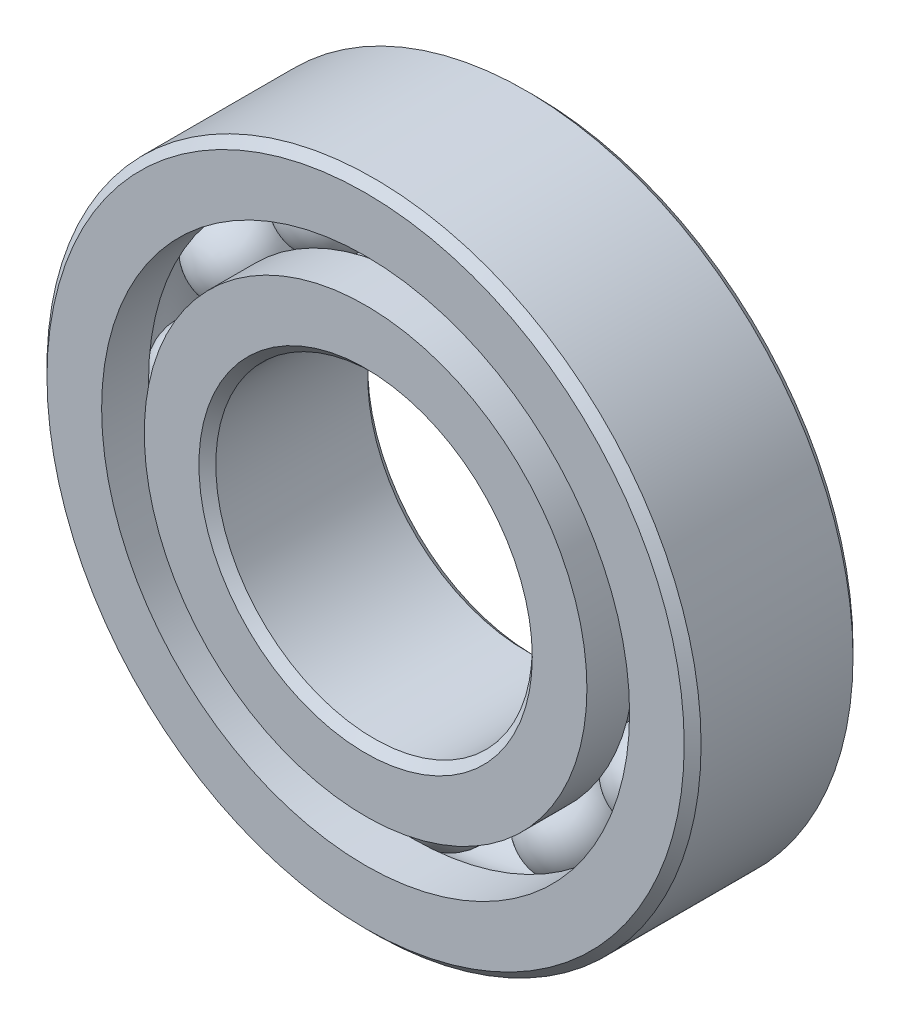
ISO-10303-21;
HEADER;
FILE_DESCRIPTION(('STEP AP214'),'2;1');
FILE_NAME('part.step','',(''),(''),'','','');
FILE_SCHEMA(('AUTOMOTIVE_DESIGN { 1 0 10303 214 1 1 1 1 }'));
ENDSEC;
DATA;
#1=APPLICATION_CONTEXT('core data for automotive mechanical design processes');
#2=APPLICATION_PROTOCOL_DEFINITION('international standard','automotive_design',2000,#1);
#3=PRODUCT_CONTEXT('',#1,'mechanical');
#4=PRODUCT('Part','Part','',(#3));
#5=PRODUCT_RELATED_PRODUCT_CATEGORY('part','',(#4));
#6=PRODUCT_DEFINITION_FORMATION('','',#4);
#7=PRODUCT_DEFINITION_CONTEXT('part definition',#1,'design');
#8=PRODUCT_DEFINITION('design','',#6,#7);
#9=PRODUCT_DEFINITION_SHAPE('','',#8);
#10=(LENGTH_UNIT() NAMED_UNIT(*) SI_UNIT(.MILLI.,.METRE.));
#11=(NAMED_UNIT(*) PLANE_ANGLE_UNIT() SI_UNIT($,.RADIAN.));
#12=(NAMED_UNIT(*) SI_UNIT($,.STERADIAN.) SOLID_ANGLE_UNIT());
#13=UNCERTAINTY_MEASURE_WITH_UNIT(LENGTH_MEASURE(1.E-05),#10,'distance_accuracy_value','');
#14=(GEOMETRIC_REPRESENTATION_CONTEXT(3) GLOBAL_UNCERTAINTY_ASSIGNED_CONTEXT((#13)) GLOBAL_UNIT_ASSIGNED_CONTEXT((#10,
#11,#12)) REPRESENTATION_CONTEXT('',''));
#15=CARTESIAN_POINT('',(0.,0.,0.));
#16=DIRECTION('',(0.,0.,1.));
#17=DIRECTION('',(1.,0.,0.));
#18=AXIS2_PLACEMENT_3D('',#15,#16,#17);
#19=CARTESIAN_POINT('',(-11.4999999999997,19.9185842870422,0.));
#20=DIRECTION('',(0.,0.,1.));
#21=DIRECTION('',(-0.499999999999989,0.866025403784445,0.));
#22=AXIS2_PLACEMENT_3D('',#19,#20,#21);
#23=SPHERICAL_SURFACE('',#22,4.0902775492629);
#24=CARTESIAN_POINT('',(-11.4999999999997,19.9185842870422,4.0902775492629));
#25=VERTEX_POINT('',#24);
#26=VERTEX_LOOP('',#25);
#27=FACE_BOUND('',#26,.T.);
#28=ADVANCED_FACE('F37',(#27),#23,.T.);
#29=CLOSED_SHELL('',(#28));
#30=MANIFOLD_SOLID_BREP('B2',#29);
#31=CARTESIAN_POINT('',(-19.918584287042,11.5000000000002,0.));
#32=DIRECTION('',(0.,0.,1.));
#33=DIRECTION('',(-0.866025403784433,0.50000000000001,0.));
#34=AXIS2_PLACEMENT_3D('',#31,#32,#33);
#35=SPHERICAL_SURFACE('',#34,4.0902775492629);
#36=CARTESIAN_POINT('',(-19.918584287042,11.5000000000002,4.0902775492629));
#37=VERTEX_POINT('',#36);
#38=VERTEX_LOOP('',#37);
#39=FACE_BOUND('',#38,.T.);
#40=ADVANCED_FACE('F57',(#39),#35,.T.);
#41=CLOSED_SHELL('',(#40));
#42=MANIFOLD_SOLID_BREP('B6',#41);
#43=CARTESIAN_POINT('',(-23.,2.40912212380176E-13,0.));
#44=DIRECTION('',(0.,0.,1.));
#45=DIRECTION('',(-1.,0.,0.));
#46=AXIS2_PLACEMENT_3D('',#43,#44,#45);
#47=SPHERICAL_SURFACE('',#46,4.0902775492629);
#48=CARTESIAN_POINT('',(-23.,2.40912212380176E-13,4.0902775492629));
#49=VERTEX_POINT('',#48);
#50=VERTEX_LOOP('',#49);
#51=FACE_BOUND('',#50,.T.);
#52=ADVANCED_FACE('F77',(#51),#47,.T.);
#53=CLOSED_SHELL('',(#52));
#54=MANIFOLD_SOLID_BREP('B33',#53);
#55=CARTESIAN_POINT('',(-19.9185842870422,-11.4999999999998,0.));
#56=DIRECTION('',(0.,0.,1.));
#57=DIRECTION('',(-0.866025403784443,-0.499999999999992,0.));
#58=AXIS2_PLACEMENT_3D('',#55,#56,#57);
#59=SPHERICAL_SURFACE('',#58,4.0902775492629);
#60=CARTESIAN_POINT('',(-19.9185842870422,-11.4999999999998,4.0902775492629));
#61=VERTEX_POINT('',#60);
#62=VERTEX_LOOP('',#61);
#63=FACE_BOUND('',#62,.T.);
#64=ADVANCED_FACE('F97',(#63),#59,.T.);
#65=CLOSED_SHELL('',(#64));
#66=MANIFOLD_SOLID_BREP('B53',#65);
#67=CARTESIAN_POINT('',(-11.5000000000002,-19.918584287042,0.));
#68=DIRECTION('',(0.,0.,1.));
#69=DIRECTION('',(-0.500000000000007,-0.866025403784435,0.));
#70=AXIS2_PLACEMENT_3D('',#67,#68,#69);
#71=SPHERICAL_SURFACE('',#70,4.0902775492629);
#72=CARTESIAN_POINT('',(-11.5000000000002,-19.918584287042,4.0902775492629));
#73=VERTEX_POINT('',#72);
#74=VERTEX_LOOP('',#73);
#75=FACE_BOUND('',#74,.T.);
#76=ADVANCED_FACE('F117',(#75),#71,.T.);
#77=CLOSED_SHELL('',(#76));
#78=MANIFOLD_SOLID_BREP('B73',#77);
#79=CARTESIAN_POINT('',(-1.60608141586784E-13,-23.,0.));
#80=DIRECTION('',(0.,0.,1.));
#81=DIRECTION('',(0.,-1.,0.));
#82=AXIS2_PLACEMENT_3D('',#79,#80,#81);
#83=SPHERICAL_SURFACE('',#82,4.0902775492629);
#84=CARTESIAN_POINT('',(-1.60608141586784E-13,-23.,4.0902775492629));
#85=VERTEX_POINT('',#84);
#86=VERTEX_LOOP('',#85);
#87=FACE_BOUND('',#86,.T.);
#88=ADVANCED_FACE('F137',(#87),#83,.T.);
#89=CLOSED_SHELL('',(#88));
#90=MANIFOLD_SOLID_BREP('B93',#89);
#91=CARTESIAN_POINT('',(11.4999999999999,-19.9185842870422,0.));
#92=DIRECTION('',(0.,0.,1.));
#93=DIRECTION('',(0.499999999999995,-0.866025403784442,0.));
#94=AXIS2_PLACEMENT_3D('',#91,#92,#93);
#95=SPHERICAL_SURFACE('',#94,4.0902775492629);
#96=CARTESIAN_POINT('',(11.4999999999999,-19.9185842870422,4.0902775492629));
#97=VERTEX_POINT('',#96);
#98=VERTEX_LOOP('',#97);
#99=FACE_BOUND('',#98,.T.);
#100=ADVANCED_FACE('F157',(#99),#95,.T.);
#101=CLOSED_SHELL('',(#100));
#102=MANIFOLD_SOLID_BREP('B113',#101);
#103=CARTESIAN_POINT('',(19.918584287042,-11.5000000000001,0.));
#104=DIRECTION('',(0.,0.,1.));
#105=DIRECTION('',(0.866025403784436,-0.500000000000004,0.));
#106=AXIS2_PLACEMENT_3D('',#103,#104,#105);
#107=SPHERICAL_SURFACE('',#106,4.0902775492629);
#108=CARTESIAN_POINT('',(19.918584287042,-11.5000000000001,4.0902775492629));
#109=VERTEX_POINT('',#108);
#110=VERTEX_LOOP('',#109);
#111=FACE_BOUND('',#110,.T.);
#112=ADVANCED_FACE('F177',(#111),#107,.T.);
#113=CLOSED_SHELL('',(#112));
#114=MANIFOLD_SOLID_BREP('B133',#113);
#115=CARTESIAN_POINT('',(23.,0.,0.));
#116=DIRECTION('',(0.,0.,1.));
#117=DIRECTION('',(1.,0.,0.));
#118=AXIS2_PLACEMENT_3D('',#115,#116,#117);
#119=SPHERICAL_SURFACE('',#118,4.0902775492629);
#120=CARTESIAN_POINT('',(23.,0.,4.0902775492629));
#121=VERTEX_POINT('',#120);
#122=VERTEX_LOOP('',#121);
#123=FACE_BOUND('',#122,.T.);
#124=ADVANCED_FACE('F197',(#123),#119,.T.);
#125=CLOSED_SHELL('',(#124));
#126=MANIFOLD_SOLID_BREP('B153',#125);
#127=CARTESIAN_POINT('',(19.9185842870421,11.5,0.));
#128=DIRECTION('',(0.,0.,1.));
#129=DIRECTION('',(0.86602540378444,0.499999999999998,0.));
#130=AXIS2_PLACEMENT_3D('',#127,#128,#129);
#131=SPHERICAL_SURFACE('',#130,4.0902775492629);
#132=CARTESIAN_POINT('',(19.9185842870421,11.5,4.0902775492629));
#133=VERTEX_POINT('',#132);
#134=VERTEX_LOOP('',#133);
#135=FACE_BOUND('',#134,.T.);
#136=ADVANCED_FACE('F217',(#135),#131,.T.);
#137=CLOSED_SHELL('',(#136));
#138=MANIFOLD_SOLID_BREP('B173',#137);
#139=CARTESIAN_POINT('',(11.5,19.9185842870421,0.));
#140=DIRECTION('',(0.,0.,1.));
#141=DIRECTION('',(0.500000000000001,0.866025403784438,0.));
#142=AXIS2_PLACEMENT_3D('',#139,#140,#141);
#143=SPHERICAL_SURFACE('',#142,4.0902775492629);
#144=CARTESIAN_POINT('',(11.5,19.9185842870421,4.0902775492629));
#145=VERTEX_POINT('',#144);
#146=VERTEX_LOOP('',#145);
#147=FACE_BOUND('',#146,.T.);
#148=ADVANCED_FACE('F237',(#147),#143,.T.);
#149=CLOSED_SHELL('',(#148));
#150=MANIFOLD_SOLID_BREP('B193',#149);
#151=CARTESIAN_POINT('',(0.,23.,0.));
#152=DIRECTION('',(0.,0.,1.));
#153=DIRECTION('',(0.,1.,0.));
#154=AXIS2_PLACEMENT_3D('',#151,#152,#153);
#155=SPHERICAL_SURFACE('',#154,4.0902775492629);
#156=CARTESIAN_POINT('',(0.,23.,4.0902775492629));
#157=VERTEX_POINT('',#156);
#158=VERTEX_LOOP('',#157);
#159=FACE_BOUND('',#158,.T.);
#160=ADVANCED_FACE('F259',(#159),#155,.T.);
#161=CLOSED_SHELL('',(#160));
#162=MANIFOLD_SOLID_BREP('B213',#161);
#163=CARTESIAN_POINT('',(0.,20.978021978022,8.));
#164=DIRECTION('',(0.,0.,-1.));
#165=DIRECTION('',(-1.,0.,0.));
#166=AXIS2_PLACEMENT_3D('',#163,#164,#165);
#167=PLANE('',#166);
#168=CARTESIAN_POINT('',(0.,0.,8.));
#169=DIRECTION('',(0.,0.,1.));
#170=DIRECTION('',(1.,0.,0.));
#171=AXIS2_PLACEMENT_3D('',#168,#169,#170);
#172=CIRCLE('',#171,15.8);
#173=CARTESIAN_POINT('',(15.8,0.,8.));
#174=VERTEX_POINT('',#173);
#175=EDGE_CURVE('E306',#174,#174,#172,.T.);
#176=ORIENTED_EDGE('',*,*,#175,.F.);
#177=EDGE_LOOP('',(#176));
#178=FACE_BOUND('',#177,.T.);
#179=CARTESIAN_POINT('',(0.,0.,8.));
#180=DIRECTION('',(0.,0.,1.));
#181=DIRECTION('',(1.,0.,0.));
#182=AXIS2_PLACEMENT_3D('',#179,#180,#181);
#183=CIRCLE('',#182,20.978021978022);
#184=CARTESIAN_POINT('',(20.978021978022,0.,8.));
#185=VERTEX_POINT('',#184);
#186=EDGE_CURVE('E258',#185,#185,#183,.T.);
#187=ORIENTED_EDGE('',*,*,#186,.T.);
#188=EDGE_LOOP('',(#187));
#189=FACE_BOUND('',#188,.T.);
#190=ADVANCED_FACE('F278',(#178,#189),#167,.F.);
#191=CARTESIAN_POINT('',(0.,0.,8.));
#192=DIRECTION('',(0.,0.,1.));
#193=DIRECTION('',(1.,0.,0.));
#194=AXIS2_PLACEMENT_3D('',#191,#192,#193);
#195=CYLINDRICAL_SURFACE('',#194,20.978021978022);
#196=ORIENTED_EDGE('',*,*,#186,.F.);
#197=EDGE_LOOP('',(#196));
#198=FACE_BOUND('',#197,.T.);
#199=CARTESIAN_POINT('',(0.,0.,3.55555555555555));
#200=DIRECTION('',(0.,0.,1.));
#201=DIRECTION('',(1.,0.,0.));
#202=AXIS2_PLACEMENT_3D('',#199,#200,#201);
#203=CIRCLE('',#202,20.978021978022);
#204=CARTESIAN_POINT('',(20.978021978022,0.,3.55555555555555));
#205=VERTEX_POINT('',#204);
#206=EDGE_CURVE('E284',#205,#205,#203,.T.);
#207=ORIENTED_EDGE('',*,*,#206,.T.);
#208=EDGE_LOOP('',(#207));
#209=FACE_BOUND('',#208,.T.);
#210=ADVANCED_FACE('F313',(#198,#209),#195,.T.);
#211=CARTESIAN_POINT('',(0.,0.,0.));
#212=DIRECTION('',(0.,0.,1.));
#213=DIRECTION('',(1.,0.,0.));
#214=AXIS2_PLACEMENT_3D('',#211,#212,#213);
#215=TOROIDAL_SURFACE('',#214,23.,4.09027754926289);
#216=ORIENTED_EDGE('',*,*,#206,.F.);
#217=EDGE_LOOP('',(#216));
#218=FACE_BOUND('',#217,.T.);
#219=CARTESIAN_POINT('',(0.,0.,-3.55555555555556));
#220=DIRECTION('',(0.,0.,1.));
#221=DIRECTION('',(1.,0.,0.));
#222=AXIS2_PLACEMENT_3D('',#219,#220,#221);
#223=CIRCLE('',#222,20.978021978022);
#224=CARTESIAN_POINT('',(20.978021978022,0.,-3.55555555555556));
#225=VERTEX_POINT('',#224);
#226=EDGE_CURVE('E288',#225,#225,#223,.T.);
#227=ORIENTED_EDGE('',*,*,#226,.T.);
#228=EDGE_LOOP('',(#227));
#229=FACE_BOUND('',#228,.T.);
#230=ADVANCED_FACE('F317',(#218,#229),#215,.F.);
#231=CARTESIAN_POINT('',(0.,0.,8.));
#232=DIRECTION('',(0.,0.,1.));
#233=DIRECTION('',(1.,0.,0.));
#234=AXIS2_PLACEMENT_3D('',#231,#232,#233);
#235=CYLINDRICAL_SURFACE('',#234,20.978021978022);
#236=ORIENTED_EDGE('',*,*,#226,.F.);
#237=EDGE_LOOP('',(#236));
#238=FACE_BOUND('',#237,.T.);
#239=CARTESIAN_POINT('',(0.,0.,-8.));
#240=DIRECTION('',(0.,0.,1.));
#241=DIRECTION('',(1.,0.,0.));
#242=AXIS2_PLACEMENT_3D('',#239,#240,#241);
#243=CIRCLE('',#242,20.978021978022);
#244=CARTESIAN_POINT('',(20.978021978022,0.,-8.));
#245=VERTEX_POINT('',#244);
#246=EDGE_CURVE('E292',#245,#245,#243,.T.);
#247=ORIENTED_EDGE('',*,*,#246,.T.);
#248=EDGE_LOOP('',(#247));
#249=FACE_BOUND('',#248,.T.);
#250=ADVANCED_FACE('F322',(#238,#249),#235,.T.);
#251=CARTESIAN_POINT('',(0.,15.8,-8.));
#252=DIRECTION('',(0.,0.,1.));
#253=DIRECTION('',(1.,0.,0.));
#254=AXIS2_PLACEMENT_3D('',#251,#252,#253);
#255=PLANE('',#254);
#256=ORIENTED_EDGE('',*,*,#246,.F.);
#257=EDGE_LOOP('',(#256));
#258=FACE_BOUND('',#257,.T.);
#259=CARTESIAN_POINT('',(0.,0.,-8.));
#260=DIRECTION('',(0.,0.,1.));
#261=DIRECTION('',(1.,0.,0.));
#262=AXIS2_PLACEMENT_3D('',#259,#260,#261);
#263=CIRCLE('',#262,15.8);
#264=CARTESIAN_POINT('',(15.8,0.,-8.));
#265=VERTEX_POINT('',#264);
#266=EDGE_CURVE('E297',#265,#265,#263,.T.);
#267=ORIENTED_EDGE('',*,*,#266,.T.);
#268=EDGE_LOOP('',(#267));
#269=FACE_BOUND('',#268,.T.);
#270=ADVANCED_FACE('F328',(#258,#269),#255,.F.);
#271=CARTESIAN_POINT('',(0.,0.,-7.2));
#272=DIRECTION('',(0.,0.,-1.));
#273=DIRECTION('',(-1.,0.,0.));
#274=AXIS2_PLACEMENT_3D('',#271,#272,#273);
#275=CONICAL_SURFACE('',#274,15.,0.785398163397452);
#276=ORIENTED_EDGE('',*,*,#266,.F.);
#277=EDGE_LOOP('',(#276));
#278=FACE_BOUND('',#277,.T.);
#279=CARTESIAN_POINT('',(0.,0.,-7.2));
#280=DIRECTION('',(0.,0.,1.));
#281=DIRECTION('',(1.,0.,0.));
#282=AXIS2_PLACEMENT_3D('',#279,#280,#281);
#283=CIRCLE('',#282,15.);
#284=CARTESIAN_POINT('',(15.,0.,-7.2));
#285=VERTEX_POINT('',#284);
#286=EDGE_CURVE('E300',#285,#285,#283,.T.);
#287=ORIENTED_EDGE('',*,*,#286,.T.);
#288=EDGE_LOOP('',(#287));
#289=FACE_BOUND('',#288,.T.);
#290=ADVANCED_FACE('F332',(#278,#289),#275,.F.);
#291=CARTESIAN_POINT('',(0.,0.,8.));
#292=DIRECTION('',(0.,0.,1.));
#293=DIRECTION('',(1.,0.,0.));
#294=AXIS2_PLACEMENT_3D('',#291,#292,#293);
#295=CYLINDRICAL_SURFACE('',#294,15.);
#296=ORIENTED_EDGE('',*,*,#286,.F.);
#297=EDGE_LOOP('',(#296));
#298=FACE_BOUND('',#297,.T.);
#299=CARTESIAN_POINT('',(0.,0.,7.2));
#300=DIRECTION('',(0.,0.,1.));
#301=DIRECTION('',(1.,0.,0.));
#302=AXIS2_PLACEMENT_3D('',#299,#300,#301);
#303=CIRCLE('',#302,15.);
#304=CARTESIAN_POINT('',(15.,0.,7.2));
#305=VERTEX_POINT('',#304);
#306=EDGE_CURVE('E303',#305,#305,#303,.T.);
#307=ORIENTED_EDGE('',*,*,#306,.T.);
#308=EDGE_LOOP('',(#307));
#309=FACE_BOUND('',#308,.T.);
#310=ADVANCED_FACE('F336',(#298,#309),#295,.F.);
#311=CARTESIAN_POINT('',(0.,0.,8.));
#312=DIRECTION('',(0.,0.,1.));
#313=DIRECTION('',(1.,0.,0.));
#314=AXIS2_PLACEMENT_3D('',#311,#312,#313);
#315=CONICAL_SURFACE('',#314,15.8,0.785398163397447);
#316=ORIENTED_EDGE('',*,*,#306,.F.);
#317=EDGE_LOOP('',(#316));
#318=FACE_BOUND('',#317,.T.);
#319=ORIENTED_EDGE('',*,*,#175,.T.);
#320=EDGE_LOOP('',(#319));
#321=FACE_BOUND('',#320,.T.);
#322=ADVANCED_FACE('F310',(#318,#321),#315,.F.);
#323=CLOSED_SHELL('',(#190,#210,#230,#250,#270,#290,#310,#322));
#324=MANIFOLD_SOLID_BREP('B233',#323);
#325=CARTESIAN_POINT('',(0.,0.,7.2));
#326=DIRECTION('',(0.,0.,-1.));
#327=DIRECTION('',(-1.,0.,0.));
#328=AXIS2_PLACEMENT_3D('',#325,#326,#327);
#329=CONICAL_SURFACE('',#328,31.,0.785398163397447);
#330=CARTESIAN_POINT('',(0.,0.,8.));
#331=DIRECTION('',(0.,0.,1.));
#332=DIRECTION('',(1.,0.,0.));
#333=AXIS2_PLACEMENT_3D('',#330,#331,#332);
#334=CIRCLE('',#333,30.2);
#335=CARTESIAN_POINT('',(30.2,0.,8.));
#336=VERTEX_POINT('',#335);
#337=EDGE_CURVE('E427',#336,#336,#334,.T.);
#338=ORIENTED_EDGE('',*,*,#337,.F.);
#339=EDGE_LOOP('',(#338));
#340=FACE_BOUND('',#339,.T.);
#341=CARTESIAN_POINT('',(0.,0.,7.2));
#342=DIRECTION('',(0.,0.,1.));
#343=DIRECTION('',(1.,0.,0.));
#344=AXIS2_PLACEMENT_3D('',#341,#342,#343);
#345=CIRCLE('',#344,31.);
#346=CARTESIAN_POINT('',(31.,0.,7.2));
#347=VERTEX_POINT('',#346);
#348=EDGE_CURVE('E277',#347,#347,#345,.T.);
#349=ORIENTED_EDGE('',*,*,#348,.T.);
#350=EDGE_LOOP('',(#349));
#351=FACE_BOUND('',#350,.T.);
#352=ADVANCED_FACE('F399',(#340,#351),#329,.T.);
#353=CARTESIAN_POINT('',(0.,0.,8.));
#354=DIRECTION('',(0.,0.,1.));
#355=DIRECTION('',(1.,0.,0.));
#356=AXIS2_PLACEMENT_3D('',#353,#354,#355);
#357=CYLINDRICAL_SURFACE('',#356,31.);
#358=ORIENTED_EDGE('',*,*,#348,.F.);
#359=EDGE_LOOP('',(#358));
#360=FACE_BOUND('',#359,.T.);
#361=CARTESIAN_POINT('',(0.,0.,-7.2));
#362=DIRECTION('',(0.,0.,1.));
#363=DIRECTION('',(1.,0.,0.));
#364=AXIS2_PLACEMENT_3D('',#361,#362,#363);
#365=CIRCLE('',#364,31.);
#366=CARTESIAN_POINT('',(31.,0.,-7.2));
#367=VERTEX_POINT('',#366);
#368=EDGE_CURVE('E405',#367,#367,#365,.T.);
#369=ORIENTED_EDGE('',*,*,#368,.T.);
#370=EDGE_LOOP('',(#369));
#371=FACE_BOUND('',#370,.T.);
#372=ADVANCED_FACE('F434',(#360,#371),#357,.T.);
#373=CARTESIAN_POINT('',(0.,0.,-8.));
#374=DIRECTION('',(0.,0.,1.));
#375=DIRECTION('',(1.,0.,0.));
#376=AXIS2_PLACEMENT_3D('',#373,#374,#375);
#377=CONICAL_SURFACE('',#376,30.2,0.785398163397448);
#378=ORIENTED_EDGE('',*,*,#368,.F.);
#379=EDGE_LOOP('',(#378));
#380=FACE_BOUND('',#379,.T.);
#381=CARTESIAN_POINT('',(0.,0.,-8.));
#382=DIRECTION('',(0.,0.,1.));
#383=DIRECTION('',(1.,0.,0.));
#384=AXIS2_PLACEMENT_3D('',#381,#382,#383);
#385=CIRCLE('',#384,30.2);
#386=CARTESIAN_POINT('',(30.2,0.,-8.));
#387=VERTEX_POINT('',#386);
#388=EDGE_CURVE('E409',#387,#387,#385,.T.);
#389=ORIENTED_EDGE('',*,*,#388,.T.);
#390=EDGE_LOOP('',(#389));
#391=FACE_BOUND('',#390,.T.);
#392=ADVANCED_FACE('F438',(#380,#391),#377,.T.);
#393=CARTESIAN_POINT('',(0.,30.2,-8.));
#394=DIRECTION('',(0.,0.,1.));
#395=DIRECTION('',(1.,0.,0.));
#396=AXIS2_PLACEMENT_3D('',#393,#394,#395);
#397=PLANE('',#396);
#398=ORIENTED_EDGE('',*,*,#388,.F.);
#399=EDGE_LOOP('',(#398));
#400=FACE_BOUND('',#399,.T.);
#401=CARTESIAN_POINT('',(0.,0.,-8.));
#402=DIRECTION('',(0.,0.,1.));
#403=DIRECTION('',(1.,0.,0.));
#404=AXIS2_PLACEMENT_3D('',#401,#402,#403);
#405=CIRCLE('',#404,25.021978021978);
#406=CARTESIAN_POINT('',(25.021978021978,0.,-8.));
#407=VERTEX_POINT('',#406);
#408=EDGE_CURVE('E413',#407,#407,#405,.T.);
#409=ORIENTED_EDGE('',*,*,#408,.T.);
#410=EDGE_LOOP('',(#409));
#411=FACE_BOUND('',#410,.T.);
#412=ADVANCED_FACE('F443',(#400,#411),#397,.F.);
#413=CARTESIAN_POINT('',(0.,0.,8.));
#414=DIRECTION('',(0.,0.,1.));
#415=DIRECTION('',(1.,0.,0.));
#416=AXIS2_PLACEMENT_3D('',#413,#414,#415);
#417=CYLINDRICAL_SURFACE('',#416,25.021978021978);
#418=ORIENTED_EDGE('',*,*,#408,.F.);
#419=EDGE_LOOP('',(#418));
#420=FACE_BOUND('',#419,.T.);
#421=CARTESIAN_POINT('',(0.,0.,-3.55555555555556));
#422=DIRECTION('',(0.,0.,1.));
#423=DIRECTION('',(1.,0.,0.));
#424=AXIS2_PLACEMENT_3D('',#421,#422,#423);
#425=CIRCLE('',#424,25.021978021978);
#426=CARTESIAN_POINT('',(25.021978021978,0.,-3.55555555555556));
#427=VERTEX_POINT('',#426);
#428=EDGE_CURVE('E418',#427,#427,#425,.T.);
#429=ORIENTED_EDGE('',*,*,#428,.T.);
#430=EDGE_LOOP('',(#429));
#431=FACE_BOUND('',#430,.T.);
#432=ADVANCED_FACE('F449',(#420,#431),#417,.F.);
#433=CARTESIAN_POINT('',(0.,0.,0.));
#434=DIRECTION('',(0.,0.,1.));
#435=DIRECTION('',(1.,0.,0.));
#436=AXIS2_PLACEMENT_3D('',#433,#434,#435);
#437=TOROIDAL_SURFACE('',#436,23.,4.0902775492629);
#438=ORIENTED_EDGE('',*,*,#428,.F.);
#439=EDGE_LOOP('',(#438));
#440=FACE_BOUND('',#439,.T.);
#441=CARTESIAN_POINT('',(0.,0.,3.55555555555555));
#442=DIRECTION('',(0.,0.,1.));
#443=DIRECTION('',(1.,0.,0.));
#444=AXIS2_PLACEMENT_3D('',#441,#442,#443);
#445=CIRCLE('',#444,25.021978021978);
#446=CARTESIAN_POINT('',(25.021978021978,0.,3.55555555555555));
#447=VERTEX_POINT('',#446);
#448=EDGE_CURVE('E421',#447,#447,#445,.T.);
#449=ORIENTED_EDGE('',*,*,#448,.T.);
#450=EDGE_LOOP('',(#449));
#451=FACE_BOUND('',#450,.T.);
#452=ADVANCED_FACE('F453',(#440,#451),#437,.F.);
#453=CARTESIAN_POINT('',(0.,0.,8.));
#454=DIRECTION('',(0.,0.,1.));
#455=DIRECTION('',(1.,0.,0.));
#456=AXIS2_PLACEMENT_3D('',#453,#454,#455);
#457=CYLINDRICAL_SURFACE('',#456,25.021978021978);
#458=ORIENTED_EDGE('',*,*,#448,.F.);
#459=EDGE_LOOP('',(#458));
#460=FACE_BOUND('',#459,.T.);
#461=CARTESIAN_POINT('',(0.,0.,8.));
#462=DIRECTION('',(0.,0.,1.));
#463=DIRECTION('',(1.,0.,0.));
#464=AXIS2_PLACEMENT_3D('',#461,#462,#463);
#465=CIRCLE('',#464,25.021978021978);
#466=CARTESIAN_POINT('',(25.021978021978,0.,8.));
#467=VERTEX_POINT('',#466);
#468=EDGE_CURVE('E424',#467,#467,#465,.T.);
#469=ORIENTED_EDGE('',*,*,#468,.T.);
#470=EDGE_LOOP('',(#469));
#471=FACE_BOUND('',#470,.T.);
#472=ADVANCED_FACE('F457',(#460,#471),#457,.F.);
#473=CARTESIAN_POINT('',(0.,30.2,8.));
#474=DIRECTION('',(0.,0.,-1.));
#475=DIRECTION('',(-1.,0.,0.));
#476=AXIS2_PLACEMENT_3D('',#473,#474,#475);
#477=PLANE('',#476);
#478=ORIENTED_EDGE('',*,*,#468,.F.);
#479=EDGE_LOOP('',(#478));
#480=FACE_BOUND('',#479,.T.);
#481=ORIENTED_EDGE('',*,*,#337,.T.);
#482=EDGE_LOOP('',(#481));
#483=FACE_BOUND('',#482,.T.);
#484=ADVANCED_FACE('F431',(#480,#483),#477,.F.);
#485=CLOSED_SHELL('',(#352,#372,#392,#412,#432,#452,#472,#484));
#486=MANIFOLD_SOLID_BREP('B253',#485);
#487=ADVANCED_BREP_SHAPE_REPRESENTATION('',(#18,#30,#42,#54,#66,#78,#90,#102,#114,#126,#138,
#150,#162,#324,#486),#14);
#488=SHAPE_DEFINITION_REPRESENTATION(#9,#487);
ENDSEC;
END-ISO-10303-21;
